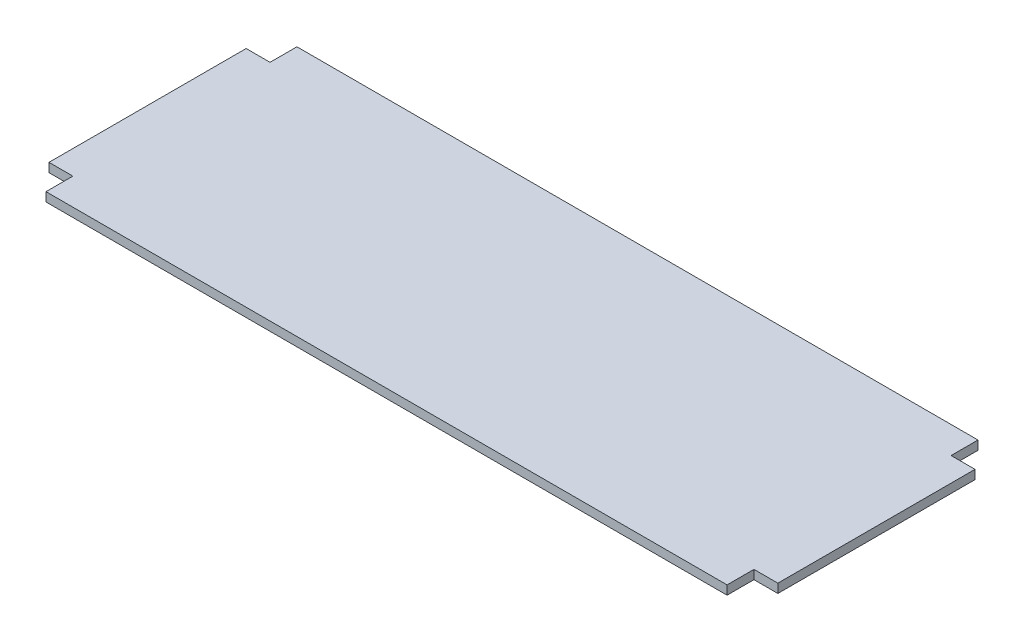
ISO-10303-21;
HEADER;
FILE_DESCRIPTION(('STEP AP214'),'2;1');
FILE_NAME('part.step','',(''),(''),'','','');
FILE_SCHEMA(('AUTOMOTIVE_DESIGN { 1 0 10303 214 1 1 1 1 }'));
ENDSEC;
DATA;
#1=APPLICATION_CONTEXT('core data for automotive mechanical design processes');
#2=APPLICATION_PROTOCOL_DEFINITION('international standard','automotive_design',2000,#1);
#3=PRODUCT_CONTEXT('',#1,'mechanical');
#4=PRODUCT('Part','Part','',(#3));
#5=PRODUCT_RELATED_PRODUCT_CATEGORY('part','',(#4));
#6=PRODUCT_DEFINITION_FORMATION('','',#4);
#7=PRODUCT_DEFINITION_CONTEXT('part definition',#1,'design');
#8=PRODUCT_DEFINITION('design','',#6,#7);
#9=PRODUCT_DEFINITION_SHAPE('','',#8);
#10=(LENGTH_UNIT() NAMED_UNIT(*) SI_UNIT(.MILLI.,.METRE.));
#11=(NAMED_UNIT(*) PLANE_ANGLE_UNIT() SI_UNIT($,.RADIAN.));
#12=(NAMED_UNIT(*) SI_UNIT($,.STERADIAN.) SOLID_ANGLE_UNIT());
#13=UNCERTAINTY_MEASURE_WITH_UNIT(LENGTH_MEASURE(1.E-05),#10,'distance_accuracy_value','');
#14=(GEOMETRIC_REPRESENTATION_CONTEXT(3) GLOBAL_UNCERTAINTY_ASSIGNED_CONTEXT((#13)) GLOBAL_UNIT_ASSIGNED_CONTEXT((#10,
#11,#12)) REPRESENTATION_CONTEXT('',''));
#15=CARTESIAN_POINT('',(0.,0.,0.));
#16=DIRECTION('',(0.,0.,1.));
#17=DIRECTION('',(1.,0.,0.));
#18=AXIS2_PLACEMENT_3D('',#15,#16,#17);
#19=CARTESIAN_POINT('',(-610.,15.,210.));
#20=DIRECTION('',(1.,0.,0.));
#21=DIRECTION('',(0.,0.,-1.));
#22=AXIS2_PLACEMENT_3D('',#19,#20,#21);
#23=PLANE('',#22);
#24=DIRECTION('',(0.,0.,1.));
#25=VECTOR('',#24,1.);
#26=CARTESIAN_POINT('',(-610.,0.,210.));
#27=LINE('',#26,#25);
#28=CARTESIAN_POINT('',(-610.,0.,-165.));
#29=VERTEX_POINT('',#28);
#30=CARTESIAN_POINT('',(-610.,0.,165.));
#31=VERTEX_POINT('',#30);
#32=EDGE_CURVE('E143',#29,#31,#27,.T.);
#33=ORIENTED_EDGE('',*,*,#32,.T.);
#34=DIRECTION('',(0.,1.,0.));
#35=VECTOR('',#34,1.);
#36=CARTESIAN_POINT('',(-610.,0.,165.));
#37=LINE('',#36,#35);
#38=CARTESIAN_POINT('',(-610.,15.,165.));
#39=VERTEX_POINT('',#38);
#40=EDGE_CURVE('E170',#31,#39,#37,.T.);
#41=ORIENTED_EDGE('',*,*,#40,.T.);
#42=DIRECTION('',(0.,0.,1.));
#43=VECTOR('',#42,1.);
#44=CARTESIAN_POINT('',(-610.,15.,210.));
#45=LINE('',#44,#43);
#46=CARTESIAN_POINT('',(-610.,15.,-165.));
#47=VERTEX_POINT('',#46);
#48=EDGE_CURVE('E153',#47,#39,#45,.T.);
#49=ORIENTED_EDGE('',*,*,#48,.F.);
#50=DIRECTION('',(0.,1.,0.));
#51=VECTOR('',#50,1.);
#52=CARTESIAN_POINT('',(-610.,0.,-165.));
#53=LINE('',#52,#51);
#54=EDGE_CURVE('E156',#29,#47,#53,.T.);
#55=ORIENTED_EDGE('',*,*,#54,.F.);
#56=EDGE_LOOP('',(#33,#41,#49,#55));
#57=FACE_BOUND('',#56,.T.);
#58=ADVANCED_FACE('F32',(#57),#23,.F.);
#59=CARTESIAN_POINT('',(610.,15.,210.));
#60=DIRECTION('',(0.,0.,-1.));
#61=DIRECTION('',(-1.,0.,0.));
#62=AXIS2_PLACEMENT_3D('',#59,#60,#61);
#63=PLANE('',#62);
#64=DIRECTION('',(1.,0.,0.));
#65=VECTOR('',#64,1.);
#66=CARTESIAN_POINT('',(610.,15.,210.));
#67=LINE('',#66,#65);
#68=CARTESIAN_POINT('',(-570.,15.,210.));
#69=VERTEX_POINT('',#68);
#70=CARTESIAN_POINT('',(570.,15.,210.));
#71=VERTEX_POINT('',#70);
#72=EDGE_CURVE('E138',#69,#71,#67,.T.);
#73=ORIENTED_EDGE('',*,*,#72,.F.);
#74=DIRECTION('',(0.,1.,0.));
#75=VECTOR('',#74,1.);
#76=CARTESIAN_POINT('',(-570.,0.,210.));
#77=LINE('',#76,#75);
#78=CARTESIAN_POINT('',(-570.,0.,210.));
#79=VERTEX_POINT('',#78);
#80=EDGE_CURVE('E124',#79,#69,#77,.T.);
#81=ORIENTED_EDGE('',*,*,#80,.F.);
#82=DIRECTION('',(1.,0.,0.));
#83=VECTOR('',#82,1.);
#84=CARTESIAN_POINT('',(610.,0.,210.));
#85=LINE('',#84,#83);
#86=CARTESIAN_POINT('',(570.,0.,210.));
#87=VERTEX_POINT('',#86);
#88=EDGE_CURVE('E136',#79,#87,#85,.T.);
#89=ORIENTED_EDGE('',*,*,#88,.T.);
#90=DIRECTION('',(0.,1.,0.));
#91=VECTOR('',#90,1.);
#92=CARTESIAN_POINT('',(570.,0.,210.));
#93=LINE('',#92,#91);
#94=EDGE_CURVE('E198',#87,#71,#93,.T.);
#95=ORIENTED_EDGE('',*,*,#94,.T.);
#96=EDGE_LOOP('',(#73,#81,#89,#95));
#97=FACE_BOUND('',#96,.T.);
#98=ADVANCED_FACE('F134',(#97),#63,.F.);
#99=CARTESIAN_POINT('',(610.,15.,210.));
#100=DIRECTION('',(-1.,0.,0.));
#101=DIRECTION('',(0.,0.,1.));
#102=AXIS2_PLACEMENT_3D('',#99,#100,#101);
#103=PLANE('',#102);
#104=DIRECTION('',(0.,0.,-1.));
#105=VECTOR('',#104,1.);
#106=CARTESIAN_POINT('',(610.,15.,210.));
#107=LINE('',#106,#105);
#108=CARTESIAN_POINT('',(610.,15.,165.));
#109=VERTEX_POINT('',#108);
#110=CARTESIAN_POINT('',(610.,15.,-165.));
#111=VERTEX_POINT('',#110);
#112=EDGE_CURVE('E40',#109,#111,#107,.T.);
#113=ORIENTED_EDGE('',*,*,#112,.F.);
#114=DIRECTION('',(0.,1.,0.));
#115=VECTOR('',#114,1.);
#116=CARTESIAN_POINT('',(610.,0.,165.));
#117=LINE('',#116,#115);
#118=CARTESIAN_POINT('',(610.,0.,165.));
#119=VERTEX_POINT('',#118);
#120=EDGE_CURVE('E194',#119,#109,#117,.T.);
#121=ORIENTED_EDGE('',*,*,#120,.F.);
#122=DIRECTION('',(0.,0.,-1.));
#123=VECTOR('',#122,1.);
#124=CARTESIAN_POINT('',(610.,0.,210.));
#125=LINE('',#124,#123);
#126=CARTESIAN_POINT('',(610.,0.,-165.));
#127=VERTEX_POINT('',#126);
#128=EDGE_CURVE('E142',#119,#127,#125,.T.);
#129=ORIENTED_EDGE('',*,*,#128,.T.);
#130=DIRECTION('',(0.,1.,0.));
#131=VECTOR('',#130,1.);
#132=CARTESIAN_POINT('',(610.,0.,-165.));
#133=LINE('',#132,#131);
#134=EDGE_CURVE('E180',#127,#111,#133,.T.);
#135=ORIENTED_EDGE('',*,*,#134,.T.);
#136=EDGE_LOOP('',(#113,#121,#129,#135));
#137=FACE_BOUND('',#136,.T.);
#138=ADVANCED_FACE('F243',(#137),#103,.F.);
#139=CARTESIAN_POINT('',(610.,15.,-210.));
#140=DIRECTION('',(0.,0.,1.));
#141=DIRECTION('',(1.,0.,0.));
#142=AXIS2_PLACEMENT_3D('',#139,#140,#141);
#143=PLANE('',#142);
#144=DIRECTION('',(-1.,0.,0.));
#145=VECTOR('',#144,1.);
#146=CARTESIAN_POINT('',(610.,15.,-210.));
#147=LINE('',#146,#145);
#148=CARTESIAN_POINT('',(570.,15.,-210.));
#149=VERTEX_POINT('',#148);
#150=CARTESIAN_POINT('',(-570.,15.,-210.));
#151=VERTEX_POINT('',#150);
#152=EDGE_CURVE('E11',#149,#151,#147,.T.);
#153=ORIENTED_EDGE('',*,*,#152,.F.);
#154=DIRECTION('',(0.,1.,0.));
#155=VECTOR('',#154,1.);
#156=CARTESIAN_POINT('',(570.,0.,-210.));
#157=LINE('',#156,#155);
#158=CARTESIAN_POINT('',(570.,0.,-210.));
#159=VERTEX_POINT('',#158);
#160=EDGE_CURVE('E175',#159,#149,#157,.T.);
#161=ORIENTED_EDGE('',*,*,#160,.F.);
#162=DIRECTION('',(-1.,0.,0.));
#163=VECTOR('',#162,1.);
#164=CARTESIAN_POINT('',(610.,0.,-210.));
#165=LINE('',#164,#163);
#166=CARTESIAN_POINT('',(-570.,0.,-210.));
#167=VERTEX_POINT('',#166);
#168=EDGE_CURVE('E35',#159,#167,#165,.T.);
#169=ORIENTED_EDGE('',*,*,#168,.T.);
#170=DIRECTION('',(0.,1.,0.));
#171=VECTOR('',#170,1.);
#172=CARTESIAN_POINT('',(-570.,0.,-210.));
#173=LINE('',#172,#171);
#174=EDGE_CURVE('E147',#167,#151,#173,.T.);
#175=ORIENTED_EDGE('',*,*,#174,.T.);
#176=EDGE_LOOP('',(#153,#161,#169,#175));
#177=FACE_BOUND('',#176,.T.);
#178=ADVANCED_FACE('F231',(#177),#143,.F.);
#179=CARTESIAN_POINT('',(0.,15.,0.));
#180=DIRECTION('',(0.,1.,0.));
#181=DIRECTION('',(0.,0.,1.));
#182=AXIS2_PLACEMENT_3D('',#179,#180,#181);
#183=PLANE('',#182);
#184=DIRECTION('',(-1.,0.,0.));
#185=VECTOR('',#184,1.);
#186=CARTESIAN_POINT('',(-610.,15.,165.));
#187=LINE('',#186,#185);
#188=CARTESIAN_POINT('',(-570.,15.,165.));
#189=VERTEX_POINT('',#188);
#190=EDGE_CURVE('E129',#189,#39,#187,.T.);
#191=ORIENTED_EDGE('',*,*,#190,.F.);
#192=DIRECTION('',(0.,0.,-1.));
#193=VECTOR('',#192,1.);
#194=CARTESIAN_POINT('',(-570.,15.,210.));
#195=LINE('',#194,#193);
#196=EDGE_CURVE('E200',#69,#189,#195,.T.);
#197=ORIENTED_EDGE('',*,*,#196,.F.);
#198=ORIENTED_EDGE('',*,*,#72,.T.);
#199=DIRECTION('',(0.,0.,1.));
#200=VECTOR('',#199,1.);
#201=CARTESIAN_POINT('',(570.,15.,210.));
#202=LINE('',#201,#200);
#203=CARTESIAN_POINT('',(570.,15.,165.));
#204=VERTEX_POINT('',#203);
#205=EDGE_CURVE('E201',#204,#71,#202,.T.);
#206=ORIENTED_EDGE('',*,*,#205,.F.);
#207=DIRECTION('',(-1.,0.,0.));
#208=VECTOR('',#207,1.);
#209=CARTESIAN_POINT('',(610.,15.,165.));
#210=LINE('',#209,#208);
#211=EDGE_CURVE('E183',#109,#204,#210,.T.);
#212=ORIENTED_EDGE('',*,*,#211,.F.);
#213=ORIENTED_EDGE('',*,*,#112,.T.);
#214=DIRECTION('',(1.,0.,0.));
#215=VECTOR('',#214,1.);
#216=CARTESIAN_POINT('',(610.,15.,-165.));
#217=LINE('',#216,#215);
#218=CARTESIAN_POINT('',(570.,15.,-165.));
#219=VERTEX_POINT('',#218);
#220=EDGE_CURVE('E184',#219,#111,#217,.T.);
#221=ORIENTED_EDGE('',*,*,#220,.F.);
#222=DIRECTION('',(0.,0.,1.));
#223=VECTOR('',#222,1.);
#224=CARTESIAN_POINT('',(570.,15.,-210.));
#225=LINE('',#224,#223);
#226=EDGE_CURVE('E187',#149,#219,#225,.T.);
#227=ORIENTED_EDGE('',*,*,#226,.F.);
#228=ORIENTED_EDGE('',*,*,#152,.T.);
#229=DIRECTION('',(0.,0.,-1.));
#230=VECTOR('',#229,1.);
#231=CARTESIAN_POINT('',(-570.,15.,-210.));
#232=LINE('',#231,#230);
#233=CARTESIAN_POINT('',(-570.,15.,-165.));
#234=VERTEX_POINT('',#233);
#235=EDGE_CURVE('E163',#234,#151,#232,.T.);
#236=ORIENTED_EDGE('',*,*,#235,.F.);
#237=DIRECTION('',(1.,0.,0.));
#238=VECTOR('',#237,1.);
#239=CARTESIAN_POINT('',(-610.,15.,-165.));
#240=LINE('',#239,#238);
#241=EDGE_CURVE('E167',#47,#234,#240,.T.);
#242=ORIENTED_EDGE('',*,*,#241,.F.);
#243=ORIENTED_EDGE('',*,*,#48,.T.);
#244=EDGE_LOOP('',(#191,#197,#198,#206,#212,#213,#221,#227,#228,#236,#242,#243));
#245=FACE_BOUND('',#244,.T.);
#246=ADVANCED_FACE('F224',(#245),#183,.T.);
#247=CARTESIAN_POINT('',(0.,0.,0.));
#248=DIRECTION('',(0.,1.,0.));
#249=DIRECTION('',(0.,0.,1.));
#250=AXIS2_PLACEMENT_3D('',#247,#248,#249);
#251=PLANE('',#250);
#252=DIRECTION('',(0.,0.,-1.));
#253=VECTOR('',#252,1.);
#254=CARTESIAN_POINT('',(-570.,0.,210.));
#255=LINE('',#254,#253);
#256=CARTESIAN_POINT('',(-570.,0.,165.));
#257=VERTEX_POINT('',#256);
#258=EDGE_CURVE('E120',#79,#257,#255,.T.);
#259=ORIENTED_EDGE('',*,*,#258,.T.);
#260=DIRECTION('',(-1.,0.,0.));
#261=VECTOR('',#260,1.);
#262=CARTESIAN_POINT('',(-610.,0.,165.));
#263=LINE('',#262,#261);
#264=EDGE_CURVE('E48',#257,#31,#263,.T.);
#265=ORIENTED_EDGE('',*,*,#264,.T.);
#266=ORIENTED_EDGE('',*,*,#32,.F.);
#267=DIRECTION('',(1.,0.,0.));
#268=VECTOR('',#267,1.);
#269=CARTESIAN_POINT('',(-610.,0.,-165.));
#270=LINE('',#269,#268);
#271=CARTESIAN_POINT('',(-570.,0.,-165.));
#272=VERTEX_POINT('',#271);
#273=EDGE_CURVE('E166',#29,#272,#270,.T.);
#274=ORIENTED_EDGE('',*,*,#273,.T.);
#275=DIRECTION('',(0.,0.,-1.));
#276=VECTOR('',#275,1.);
#277=CARTESIAN_POINT('',(-570.,0.,-210.));
#278=LINE('',#277,#276);
#279=EDGE_CURVE('E159',#272,#167,#278,.T.);
#280=ORIENTED_EDGE('',*,*,#279,.T.);
#281=ORIENTED_EDGE('',*,*,#168,.F.);
#282=DIRECTION('',(0.,0.,1.));
#283=VECTOR('',#282,1.);
#284=CARTESIAN_POINT('',(570.,0.,-210.));
#285=LINE('',#284,#283);
#286=CARTESIAN_POINT('',(570.,0.,-165.));
#287=VERTEX_POINT('',#286);
#288=EDGE_CURVE('E186',#159,#287,#285,.T.);
#289=ORIENTED_EDGE('',*,*,#288,.T.);
#290=DIRECTION('',(1.,0.,0.));
#291=VECTOR('',#290,1.);
#292=CARTESIAN_POINT('',(610.,0.,-165.));
#293=LINE('',#292,#291);
#294=EDGE_CURVE('E178',#287,#127,#293,.T.);
#295=ORIENTED_EDGE('',*,*,#294,.T.);
#296=ORIENTED_EDGE('',*,*,#128,.F.);
#297=DIRECTION('',(-1.,0.,0.));
#298=VECTOR('',#297,1.);
#299=CARTESIAN_POINT('',(610.,0.,165.));
#300=LINE('',#299,#298);
#301=CARTESIAN_POINT('',(570.,0.,165.));
#302=VERTEX_POINT('',#301);
#303=EDGE_CURVE('E203',#119,#302,#300,.T.);
#304=ORIENTED_EDGE('',*,*,#303,.T.);
#305=DIRECTION('',(0.,0.,1.));
#306=VECTOR('',#305,1.);
#307=CARTESIAN_POINT('',(570.,0.,210.));
#308=LINE('',#307,#306);
#309=EDGE_CURVE('E56',#302,#87,#308,.T.);
#310=ORIENTED_EDGE('',*,*,#309,.T.);
#311=ORIENTED_EDGE('',*,*,#88,.F.);
#312=EDGE_LOOP('',(#259,#265,#266,#274,#280,#281,#289,#295,#296,#304,#310,#311));
#313=FACE_BOUND('',#312,.T.);
#314=ADVANCED_FACE('F140',(#313),#251,.F.);
#315=CARTESIAN_POINT('',(-570.,0.,-210.));
#316=DIRECTION('',(1.,0.,0.));
#317=DIRECTION('',(0.,0.,-1.));
#318=AXIS2_PLACEMENT_3D('',#315,#316,#317);
#319=PLANE('',#318);
#320=ORIENTED_EDGE('',*,*,#235,.T.);
#321=ORIENTED_EDGE('',*,*,#174,.F.);
#322=ORIENTED_EDGE('',*,*,#279,.F.);
#323=DIRECTION('',(0.,1.,0.));
#324=VECTOR('',#323,1.);
#325=CARTESIAN_POINT('',(-570.,0.,-165.));
#326=LINE('',#325,#324);
#327=EDGE_CURVE('E158',#272,#234,#326,.T.);
#328=ORIENTED_EDGE('',*,*,#327,.T.);
#329=EDGE_LOOP('',(#320,#321,#322,#328));
#330=FACE_BOUND('',#329,.T.);
#331=ADVANCED_FACE('F229',(#330),#319,.F.);
#332=CARTESIAN_POINT('',(-610.,0.,-165.));
#333=DIRECTION('',(0.,0.,1.));
#334=DIRECTION('',(1.,0.,0.));
#335=AXIS2_PLACEMENT_3D('',#332,#333,#334);
#336=PLANE('',#335);
#337=ORIENTED_EDGE('',*,*,#241,.T.);
#338=ORIENTED_EDGE('',*,*,#327,.F.);
#339=ORIENTED_EDGE('',*,*,#273,.F.);
#340=ORIENTED_EDGE('',*,*,#54,.T.);
#341=EDGE_LOOP('',(#337,#338,#339,#340));
#342=FACE_BOUND('',#341,.T.);
#343=ADVANCED_FACE('F219',(#342),#336,.F.);
#344=CARTESIAN_POINT('',(610.,0.,-165.));
#345=DIRECTION('',(0.,0.,1.));
#346=DIRECTION('',(1.,0.,0.));
#347=AXIS2_PLACEMENT_3D('',#344,#345,#346);
#348=PLANE('',#347);
#349=ORIENTED_EDGE('',*,*,#220,.T.);
#350=ORIENTED_EDGE('',*,*,#134,.F.);
#351=ORIENTED_EDGE('',*,*,#294,.F.);
#352=DIRECTION('',(0.,1.,0.));
#353=VECTOR('',#352,1.);
#354=CARTESIAN_POINT('',(570.,0.,-165.));
#355=LINE('',#354,#353);
#356=EDGE_CURVE('E177',#287,#219,#355,.T.);
#357=ORIENTED_EDGE('',*,*,#356,.T.);
#358=EDGE_LOOP('',(#349,#350,#351,#357));
#359=FACE_BOUND('',#358,.T.);
#360=ADVANCED_FACE('F240',(#359),#348,.F.);
#361=CARTESIAN_POINT('',(570.,0.,-210.));
#362=DIRECTION('',(-1.,0.,0.));
#363=DIRECTION('',(0.,0.,1.));
#364=AXIS2_PLACEMENT_3D('',#361,#362,#363);
#365=PLANE('',#364);
#366=ORIENTED_EDGE('',*,*,#226,.T.);
#367=ORIENTED_EDGE('',*,*,#356,.F.);
#368=ORIENTED_EDGE('',*,*,#288,.F.);
#369=ORIENTED_EDGE('',*,*,#160,.T.);
#370=EDGE_LOOP('',(#366,#367,#368,#369));
#371=FACE_BOUND('',#370,.T.);
#372=ADVANCED_FACE('F237',(#371),#365,.F.);
#373=CARTESIAN_POINT('',(570.,0.,210.));
#374=DIRECTION('',(-1.,0.,0.));
#375=DIRECTION('',(0.,0.,1.));
#376=AXIS2_PLACEMENT_3D('',#373,#374,#375);
#377=PLANE('',#376);
#378=ORIENTED_EDGE('',*,*,#205,.T.);
#379=ORIENTED_EDGE('',*,*,#94,.F.);
#380=ORIENTED_EDGE('',*,*,#309,.F.);
#381=DIRECTION('',(0.,1.,0.));
#382=VECTOR('',#381,1.);
#383=CARTESIAN_POINT('',(570.,0.,165.));
#384=LINE('',#383,#382);
#385=EDGE_CURVE('E196',#302,#204,#384,.T.);
#386=ORIENTED_EDGE('',*,*,#385,.T.);
#387=EDGE_LOOP('',(#378,#379,#380,#386));
#388=FACE_BOUND('',#387,.T.);
#389=ADVANCED_FACE('F249',(#388),#377,.F.);
#390=CARTESIAN_POINT('',(610.,0.,165.));
#391=DIRECTION('',(0.,0.,-1.));
#392=DIRECTION('',(-1.,0.,0.));
#393=AXIS2_PLACEMENT_3D('',#390,#391,#392);
#394=PLANE('',#393);
#395=ORIENTED_EDGE('',*,*,#211,.T.);
#396=ORIENTED_EDGE('',*,*,#385,.F.);
#397=ORIENTED_EDGE('',*,*,#303,.F.);
#398=ORIENTED_EDGE('',*,*,#120,.T.);
#399=EDGE_LOOP('',(#395,#396,#397,#398));
#400=FACE_BOUND('',#399,.T.);
#401=ADVANCED_FACE('F248',(#400),#394,.F.);
#402=CARTESIAN_POINT('',(-610.,0.,165.));
#403=DIRECTION('',(0.,0.,-1.));
#404=DIRECTION('',(-1.,0.,0.));
#405=AXIS2_PLACEMENT_3D('',#402,#403,#404);
#406=PLANE('',#405);
#407=ORIENTED_EDGE('',*,*,#190,.T.);
#408=ORIENTED_EDGE('',*,*,#40,.F.);
#409=ORIENTED_EDGE('',*,*,#264,.F.);
#410=DIRECTION('',(0.,1.,0.));
#411=VECTOR('',#410,1.);
#412=CARTESIAN_POINT('',(-570.,0.,165.));
#413=LINE('',#412,#411);
#414=EDGE_CURVE('E126',#257,#189,#413,.T.);
#415=ORIENTED_EDGE('',*,*,#414,.T.);
#416=EDGE_LOOP('',(#407,#408,#409,#415));
#417=FACE_BOUND('',#416,.T.);
#418=ADVANCED_FACE('F250',(#417),#406,.F.);
#419=CARTESIAN_POINT('',(-570.,0.,210.));
#420=DIRECTION('',(1.,0.,0.));
#421=DIRECTION('',(0.,0.,-1.));
#422=AXIS2_PLACEMENT_3D('',#419,#420,#421);
#423=PLANE('',#422);
#424=ORIENTED_EDGE('',*,*,#196,.T.);
#425=ORIENTED_EDGE('',*,*,#414,.F.);
#426=ORIENTED_EDGE('',*,*,#258,.F.);
#427=ORIENTED_EDGE('',*,*,#80,.T.);
#428=EDGE_LOOP('',(#424,#425,#426,#427));
#429=FACE_BOUND('',#428,.T.);
#430=ADVANCED_FACE('F123',(#429),#423,.F.);
#431=CLOSED_SHELL('',(#58,#98,#138,#178,#246,#314,#331,#343,#360,#372,#389,#401,#418,#430));
#432=MANIFOLD_SOLID_BREP('B2',#431);
#433=ADVANCED_BREP_SHAPE_REPRESENTATION('',(#18,#432),#14);
#434=SHAPE_DEFINITION_REPRESENTATION(#9,#433);
ENDSEC;
END-ISO-10303-21;
